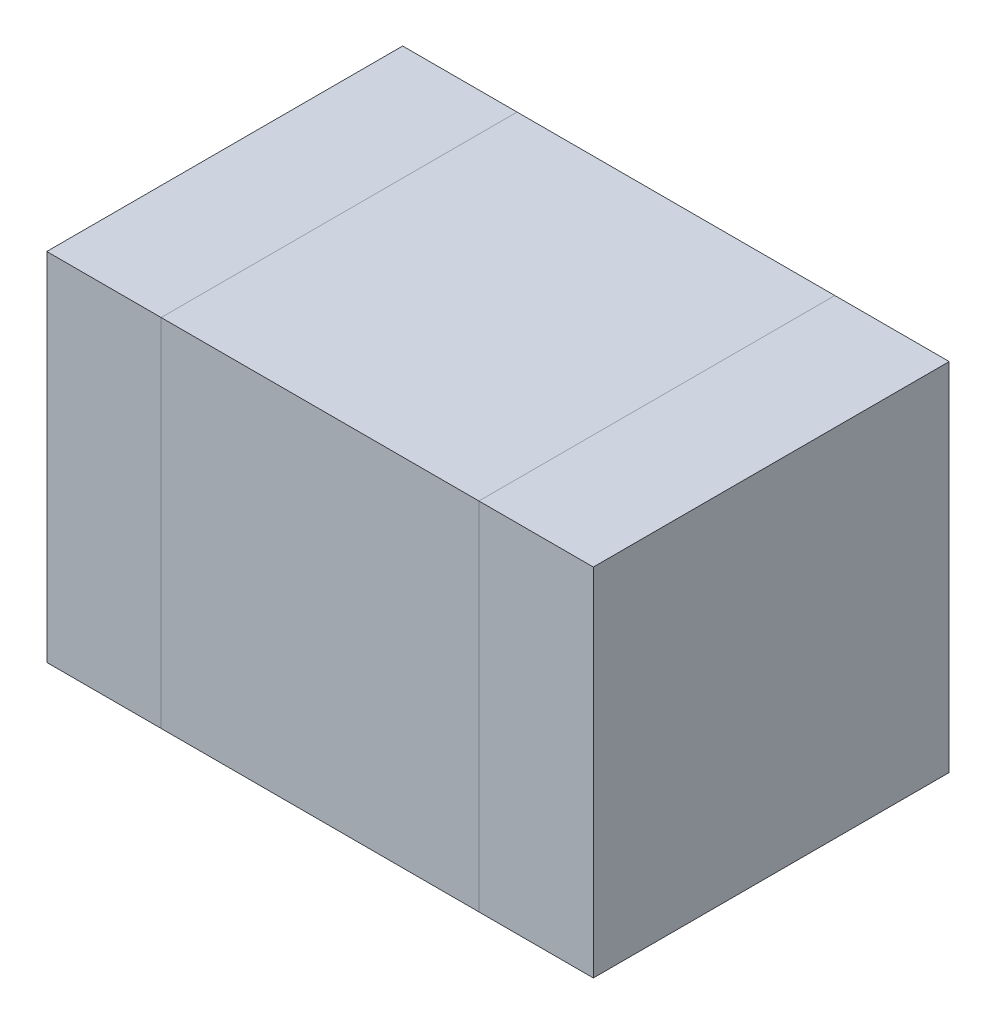
ISO-10303-21;
HEADER;
FILE_DESCRIPTION(('STEP AP214'),'2;1');
FILE_NAME('part.step','',(''),(''),'','','');
FILE_SCHEMA(('AUTOMOTIVE_DESIGN { 1 0 10303 214 1 1 1 1 }'));
ENDSEC;
DATA;
#1=APPLICATION_CONTEXT('core data for automotive mechanical design processes');
#2=APPLICATION_PROTOCOL_DEFINITION('international standard','automotive_design',2000,#1);
#3=PRODUCT_CONTEXT('',#1,'mechanical');
#4=PRODUCT('Part','Part','',(#3));
#5=PRODUCT_RELATED_PRODUCT_CATEGORY('part','',(#4));
#6=PRODUCT_DEFINITION_FORMATION('','',#4);
#7=PRODUCT_DEFINITION_CONTEXT('part definition',#1,'design');
#8=PRODUCT_DEFINITION('design','',#6,#7);
#9=PRODUCT_DEFINITION_SHAPE('','',#8);
#10=(LENGTH_UNIT() NAMED_UNIT(*) SI_UNIT(.MILLI.,.METRE.));
#11=(NAMED_UNIT(*) PLANE_ANGLE_UNIT() SI_UNIT($,.RADIAN.));
#12=(NAMED_UNIT(*) SI_UNIT($,.STERADIAN.) SOLID_ANGLE_UNIT());
#13=UNCERTAINTY_MEASURE_WITH_UNIT(LENGTH_MEASURE(1.E-05),#10,'distance_accuracy_value','');
#14=(GEOMETRIC_REPRESENTATION_CONTEXT(3) GLOBAL_UNCERTAINTY_ASSIGNED_CONTEXT((#13)) GLOBAL_UNIT_ASSIGNED_CONTEXT((#10,
#11,#12)) REPRESENTATION_CONTEXT('',''));
#15=CARTESIAN_POINT('',(0.,0.,0.));
#16=DIRECTION('',(0.,0.,1.));
#17=DIRECTION('',(1.,0.,0.));
#18=AXIS2_PLACEMENT_3D('',#15,#16,#17);
#19=CARTESIAN_POINT('',(1.07499742071203,-0.70000742291051,0.));
#20=DIRECTION('',(0.999999999999987,1.6292067073209E-07,0.));
#21=DIRECTION('',(-1.6292067073209E-07,0.999999999999987,0.));
#22=AXIS2_PLACEMENT_3D('',#19,#20,#21);
#23=PLANE('',#22);
#24=DIRECTION('',(0.,1.,0.));
#25=VECTOR('',#24,1.);
#26=CARTESIAN_POINT('',(1.07499742071203,2.19999766349792,1.39999973773956));
#27=LINE('',#26,#25);
#28=CARTESIAN_POINT('',(1.07499742071203,-0.700007441238961,1.39999973773956));
#29=VERTEX_POINT('',#28);
#30=CARTESIAN_POINT('',(1.07499730666757,0.699992434038342,1.39999973773956));
#31=VERTEX_POINT('',#30);
#32=EDGE_CURVE('P0_E68',#29,#31,#27,.T.);
#33=ORIENTED_EDGE('',*,*,#32,.F.);
#34=DIRECTION('',(0.,0.,1.));
#35=VECTOR('',#34,1.);
#36=CARTESIAN_POINT('',(1.07499742071203,-0.70000742291051,0.));
#37=LINE('',#36,#35);
#38=CARTESIAN_POINT('',(1.07499742071203,-0.700007459567413,0.));
#39=VERTEX_POINT('',#38);
#40=EDGE_CURVE('P0_E55',#39,#29,#37,.T.);
#41=ORIENTED_EDGE('',*,*,#40,.F.);
#42=DIRECTION('',(0.,1.,0.));
#43=VECTOR('',#42,1.);
#44=CARTESIAN_POINT('',(1.07499742071203,2.19999766349792,0.));
#45=LINE('',#44,#43);
#46=CARTESIAN_POINT('',(1.07499730666757,0.699992434038342,0.));
#47=VERTEX_POINT('',#46);
#48=EDGE_CURVE('P0_E20',#39,#47,#45,.T.);
#49=ORIENTED_EDGE('',*,*,#48,.T.);
#50=DIRECTION('',(0.,0.,1.));
#51=VECTOR('',#50,1.);
#52=CARTESIAN_POINT('',(1.07499719262312,0.699992434038342,0.));
#53=LINE('',#52,#51);
#54=EDGE_CURVE('P0_E81',#31,#47,#53,.F.);
#55=ORIENTED_EDGE('',*,*,#54,.F.);
#56=EDGE_LOOP('',(#33,#41,#49,#55));
#57=FACE_BOUND('',#56,.T.);
#58=ADVANCED_FACE('P0_F17',(#57),#23,.T.);
#59=CARTESIAN_POINT('',(36.0999984741211,2.19999766349792,0.));
#60=DIRECTION('',(0.,0.,1.));
#61=DIRECTION('',(1.,0.,0.));
#62=AXIS2_PLACEMENT_3D('',#59,#60,#61);
#63=PLANE('',#62);
#64=ORIENTED_EDGE('',*,*,#48,.F.);
#65=DIRECTION('',(0.999999999999987,1.6292067073209E-07,0.));
#66=VECTOR('',#65,1.);
#67=CARTESIAN_POINT('',(0.625000472469843,-0.700007496224315,0.));
#68=LINE('',#67,#66);
#69=CARTESIAN_POINT('',(0.625000358425385,-0.700007496224315,0.));
#70=VERTEX_POINT('',#69);
#71=EDGE_CURVE('P0_E61',#70,#39,#68,.T.);
#72=ORIENTED_EDGE('',*,*,#71,.F.);
#73=DIRECTION('',(1.6292067073209E-07,-0.999999999999987,0.));
#74=VECTOR('',#73,1.);
#75=CARTESIAN_POINT('',(0.625000244380928,0.699992360724537,0.));
#76=LINE('',#75,#74);
#77=CARTESIAN_POINT('',(0.625000244380927,0.69999239738144,0.));
#78=VERTEX_POINT('',#77);
#79=EDGE_CURVE('P0_E83',#78,#70,#76,.T.);
#80=ORIENTED_EDGE('',*,*,#79,.F.);
#81=DIRECTION('',(-0.999999999999987,-1.6292067073209E-07,0.));
#82=VECTOR('',#81,1.);
#83=CARTESIAN_POINT('',(1.07499719262312,0.699992434038342,0.));
#84=LINE('',#83,#82);
#85=EDGE_CURVE('P0_E64',#47,#78,#84,.T.);
#86=ORIENTED_EDGE('',*,*,#85,.F.);
#87=EDGE_LOOP('',(#64,#72,#80,#86));
#88=FACE_BOUND('',#87,.T.);
#89=ADVANCED_FACE('P0_F60',(#88),#63,.F.);
#90=CARTESIAN_POINT('',(0.625000472469843,-0.700007496224315,0.));
#91=DIRECTION('',(1.6292067073209E-07,-0.999999999999987,0.));
#92=DIRECTION('',(0.999999999999987,1.6292067073209E-07,0.));
#93=AXIS2_PLACEMENT_3D('',#90,#91,#92);
#94=PLANE('',#93);
#95=DIRECTION('',(1.,0.,0.));
#96=VECTOR('',#95,1.);
#97=CARTESIAN_POINT('',(36.0999984741211,-0.700007496224315,1.39999973773956));
#98=LINE('',#97,#96);
#99=CARTESIAN_POINT('',(0.625000415447614,-0.700007496224315,1.39999973773956));
#100=VERTEX_POINT('',#99);
#101=EDGE_CURVE('P0_E70',#100,#29,#98,.T.);
#102=ORIENTED_EDGE('',*,*,#101,.F.);
#103=DIRECTION('',(0.,0.,1.));
#104=VECTOR('',#103,1.);
#105=CARTESIAN_POINT('',(0.625000472469844,-0.700007496224315,0.));
#106=LINE('',#105,#104);
#107=EDGE_CURVE('P0_E74',#70,#100,#106,.T.);
#108=ORIENTED_EDGE('',*,*,#107,.F.);
#109=ORIENTED_EDGE('',*,*,#71,.T.);
#110=ORIENTED_EDGE('',*,*,#40,.T.);
#111=EDGE_LOOP('',(#102,#108,#109,#110));
#112=FACE_BOUND('',#111,.T.);
#113=ADVANCED_FACE('P0_F72',(#112),#94,.T.);
#114=CARTESIAN_POINT('',(36.0999984741211,2.19999766349792,1.39999973773956));
#115=DIRECTION('',(0.,0.,1.));
#116=DIRECTION('',(1.,0.,0.));
#117=AXIS2_PLACEMENT_3D('',#114,#115,#116);
#118=PLANE('',#117);
#119=ORIENTED_EDGE('',*,*,#32,.T.);
#120=DIRECTION('',(-0.999999999999987,-1.6292067073209E-07,0.));
#121=VECTOR('',#120,1.);
#122=CARTESIAN_POINT('',(1.07499719262312,0.699992434038342,1.39999973773956));
#123=LINE('',#122,#121);
#124=CARTESIAN_POINT('',(0.625000244380927,0.69999239738144,1.39999973773956));
#125=VERTEX_POINT('',#124);
#126=EDGE_CURVE('P0_E35',#125,#31,#123,.F.);
#127=ORIENTED_EDGE('',*,*,#126,.F.);
#128=DIRECTION('',(1.6292067073209E-07,-0.999999999999987,0.));
#129=VECTOR('',#128,1.);
#130=CARTESIAN_POINT('',(0.625000244380928,0.699992360724537,1.39999973773956));
#131=LINE('',#130,#129);
#132=EDGE_CURVE('P0_E26',#100,#125,#131,.F.);
#133=ORIENTED_EDGE('',*,*,#132,.F.);
#134=ORIENTED_EDGE('',*,*,#101,.T.);
#135=EDGE_LOOP('',(#119,#127,#133,#134));
#136=FACE_BOUND('',#135,.T.);
#137=ADVANCED_FACE('P0_F89',(#136),#118,.T.);
#138=CARTESIAN_POINT('',(1.07499719262312,0.699992434038342,0.));
#139=DIRECTION('',(-1.6292067073209E-07,0.999999999999987,0.));
#140=DIRECTION('',(-0.999999999999987,-1.6292067073209E-07,0.));
#141=AXIS2_PLACEMENT_3D('',#138,#139,#140);
#142=PLANE('',#141);
#143=ORIENTED_EDGE('',*,*,#126,.T.);
#144=ORIENTED_EDGE('',*,*,#54,.T.);
#145=ORIENTED_EDGE('',*,*,#85,.T.);
#146=DIRECTION('',(0.,0.,1.));
#147=VECTOR('',#146,1.);
#148=CARTESIAN_POINT('',(0.625000244380928,0.699992360724537,0.));
#149=LINE('',#148,#147);
#150=EDGE_CURVE('P0_E11',#125,#78,#149,.F.);
#151=ORIENTED_EDGE('',*,*,#150,.F.);
#152=EDGE_LOOP('',(#143,#144,#145,#151));
#153=FACE_BOUND('',#152,.T.);
#154=ADVANCED_FACE('P0_F91',(#153),#142,.T.);
#155=CARTESIAN_POINT('',(0.625000244380928,0.699992360724537,0.));
#156=DIRECTION('',(-0.999999999999987,-1.6292067073209E-07,0.));
#157=DIRECTION('',(1.6292067073209E-07,-0.999999999999987,0.));
#158=AXIS2_PLACEMENT_3D('',#155,#156,#157);
#159=PLANE('',#158);
#160=ORIENTED_EDGE('',*,*,#132,.T.);
#161=ORIENTED_EDGE('',*,*,#150,.T.);
#162=ORIENTED_EDGE('',*,*,#79,.T.);
#163=ORIENTED_EDGE('',*,*,#107,.T.);
#164=EDGE_LOOP('',(#160,#161,#162,#163));
#165=FACE_BOUND('',#164,.T.);
#166=ADVANCED_FACE('P0_F88',(#165),#159,.T.);
#167=CLOSED_SHELL('',(#58,#89,#113,#137,#154,#166));
#168=MANIFOLD_SOLID_BREP('P0_B1',#167);
#169=CARTESIAN_POINT('',(0.625000472469843,-0.700007496224315,0.));
#170=DIRECTION('',(0.999999999999987,1.6292067073209E-07,0.));
#171=DIRECTION('',(-1.6292067073209E-07,0.999999999999987,0.));
#172=AXIS2_PLACEMENT_3D('',#169,#170,#171);
#173=PLANE('',#172);
#174=DIRECTION('',(0.,1.,0.));
#175=VECTOR('',#174,1.);
#176=CARTESIAN_POINT('',(0.625000472469842,2.19999766349792,1.39999973773956));
#177=LINE('',#176,#175);
#178=CARTESIAN_POINT('',(0.625000472469843,-0.700007547137025,1.39999973773956));
#179=VERTEX_POINT('',#178);
#180=CARTESIAN_POINT('',(0.625000358425385,0.699992360724537,1.39999973773956));
#181=VERTEX_POINT('',#180);
#182=EDGE_CURVE('P1_E68',#179,#181,#177,.T.);
#183=ORIENTED_EDGE('',*,*,#182,.F.);
#184=DIRECTION('',(0.,0.,1.));
#185=VECTOR('',#184,1.);
#186=CARTESIAN_POINT('',(0.625000472469843,-0.700007496224316,0.));
#187=LINE('',#186,#185);
#188=CARTESIAN_POINT('',(0.625000472469842,-0.700007598049735,0.));
#189=VERTEX_POINT('',#188);
#190=EDGE_CURVE('P1_E55',#189,#179,#187,.T.);
#191=ORIENTED_EDGE('',*,*,#190,.F.);
#192=DIRECTION('',(0.,1.,0.));
#193=VECTOR('',#192,1.);
#194=CARTESIAN_POINT('',(0.625000472469842,2.19999766349792,0.));
#195=LINE('',#194,#193);
#196=CARTESIAN_POINT('',(0.625000358425385,0.699992360724537,0.));
#197=VERTEX_POINT('',#196);
#198=EDGE_CURVE('P1_E20',#189,#197,#195,.T.);
#199=ORIENTED_EDGE('',*,*,#198,.T.);
#200=DIRECTION('',(0.,0.,1.));
#201=VECTOR('',#200,1.);
#202=CARTESIAN_POINT('',(0.625000244380928,0.699992360724537,0.));
#203=LINE('',#202,#201);
#204=EDGE_CURVE('P1_E81',#181,#197,#203,.F.);
#205=ORIENTED_EDGE('',*,*,#204,.F.);
#206=EDGE_LOOP('',(#183,#191,#199,#205));
#207=FACE_BOUND('',#206,.T.);
#208=ADVANCED_FACE('P1_F17',(#207),#173,.T.);
#209=CARTESIAN_POINT('',(36.0999984741211,2.19999766349792,0.));
#210=DIRECTION('',(0.,0.,1.));
#211=DIRECTION('',(1.,0.,0.));
#212=AXIS2_PLACEMENT_3D('',#209,#210,#211);
#213=PLANE('',#212);
#214=ORIENTED_EDGE('',*,*,#198,.F.);
#215=DIRECTION('',(0.999999999999987,1.6292067073209E-07,0.));
#216=VECTOR('',#215,1.);
#217=CARTESIAN_POINT('',(-0.624999527530157,-0.700007699875154,0.));
#218=LINE('',#217,#216);
#219=CARTESIAN_POINT('',(-0.624999641574616,-0.700007699875154,0.));
#220=VERTEX_POINT('',#219);
#221=EDGE_CURVE('P1_E61',#220,#189,#218,.T.);
#222=ORIENTED_EDGE('',*,*,#221,.F.);
#223=DIRECTION('',(1.6292067073209E-07,-0.999999999999987,0.));
#224=VECTOR('',#223,1.);
#225=CARTESIAN_POINT('',(-0.624999755619072,0.699992157073699,0.));
#226=LINE('',#225,#224);
#227=CARTESIAN_POINT('',(-0.624999755619074,0.699992258899118,0.));
#228=VERTEX_POINT('',#227);
#229=EDGE_CURVE('P1_E83',#228,#220,#226,.T.);
#230=ORIENTED_EDGE('',*,*,#229,.F.);
#231=DIRECTION('',(-0.999999999999987,-1.6292067073209E-07,0.));
#232=VECTOR('',#231,1.);
#233=CARTESIAN_POINT('',(0.625000244380928,0.699992360724537,0.));
#234=LINE('',#233,#232);
#235=EDGE_CURVE('P1_E64',#197,#228,#234,.T.);
#236=ORIENTED_EDGE('',*,*,#235,.F.);
#237=EDGE_LOOP('',(#214,#222,#230,#236));
#238=FACE_BOUND('',#237,.T.);
#239=ADVANCED_FACE('P1_F60',(#238),#213,.F.);
#240=CARTESIAN_POINT('',(-0.624999527530157,-0.700007699875154,0.));
#241=DIRECTION('',(1.6292067073209E-07,-0.999999999999987,0.));
#242=DIRECTION('',(0.999999999999987,1.6292067073209E-07,0.));
#243=AXIS2_PLACEMENT_3D('',#240,#241,#242);
#244=PLANE('',#243);
#245=DIRECTION('',(1.,0.,0.));
#246=VECTOR('',#245,1.);
#247=CARTESIAN_POINT('',(36.0999984741211,-0.700007699875154,1.39999973773956));
#248=LINE('',#247,#246);
#249=CARTESIAN_POINT('',(-0.624999584552386,-0.700007699875154,1.39999973773956));
#250=VERTEX_POINT('',#249);
#251=EDGE_CURVE('P1_E70',#250,#179,#248,.T.);
#252=ORIENTED_EDGE('',*,*,#251,.F.);
#253=DIRECTION('',(0.,0.,1.));
#254=VECTOR('',#253,1.);
#255=CARTESIAN_POINT('',(-0.624999527530156,-0.700007699875154,0.));
#256=LINE('',#255,#254);
#257=EDGE_CURVE('P1_E74',#220,#250,#256,.T.);
#258=ORIENTED_EDGE('',*,*,#257,.F.);
#259=ORIENTED_EDGE('',*,*,#221,.T.);
#260=ORIENTED_EDGE('',*,*,#190,.T.);
#261=EDGE_LOOP('',(#252,#258,#259,#260));
#262=FACE_BOUND('',#261,.T.);
#263=ADVANCED_FACE('P1_F72',(#262),#244,.T.);
#264=CARTESIAN_POINT('',(36.0999984741211,2.19999766349792,1.39999973773956));
#265=DIRECTION('',(0.,0.,1.));
#266=DIRECTION('',(1.,0.,0.));
#267=AXIS2_PLACEMENT_3D('',#264,#265,#266);
#268=PLANE('',#267);
#269=ORIENTED_EDGE('',*,*,#182,.T.);
#270=DIRECTION('',(-0.999999999999987,-1.6292067073209E-07,0.));
#271=VECTOR('',#270,1.);
#272=CARTESIAN_POINT('',(0.625000244380928,0.699992360724537,1.39999973773956));
#273=LINE('',#272,#271);
#274=CARTESIAN_POINT('',(-0.624999755619074,0.699992258899118,1.39999973773956));
#275=VERTEX_POINT('',#274);
#276=EDGE_CURVE('P1_E35',#275,#181,#273,.F.);
#277=ORIENTED_EDGE('',*,*,#276,.F.);
#278=DIRECTION('',(1.6292067073209E-07,-0.999999999999987,0.));
#279=VECTOR('',#278,1.);
#280=CARTESIAN_POINT('',(-0.624999755619072,0.699992157073699,1.39999973773956));
#281=LINE('',#280,#279);
#282=EDGE_CURVE('P1_E26',#250,#275,#281,.F.);
#283=ORIENTED_EDGE('',*,*,#282,.F.);
#284=ORIENTED_EDGE('',*,*,#251,.T.);
#285=EDGE_LOOP('',(#269,#277,#283,#284));
#286=FACE_BOUND('',#285,.T.);
#287=ADVANCED_FACE('P1_F89',(#286),#268,.T.);
#288=CARTESIAN_POINT('',(0.625000244380928,0.699992360724537,0.));
#289=DIRECTION('',(-1.6292067073209E-07,0.999999999999987,0.));
#290=DIRECTION('',(-0.999999999999987,-1.6292067073209E-07,0.));
#291=AXIS2_PLACEMENT_3D('',#288,#289,#290);
#292=PLANE('',#291);
#293=ORIENTED_EDGE('',*,*,#276,.T.);
#294=ORIENTED_EDGE('',*,*,#204,.T.);
#295=ORIENTED_EDGE('',*,*,#235,.T.);
#296=DIRECTION('',(0.,0.,1.));
#297=VECTOR('',#296,1.);
#298=CARTESIAN_POINT('',(-0.624999755619072,0.699992157073699,0.));
#299=LINE('',#298,#297);
#300=EDGE_CURVE('P1_E11',#275,#228,#299,.F.);
#301=ORIENTED_EDGE('',*,*,#300,.F.);
#302=EDGE_LOOP('',(#293,#294,#295,#301));
#303=FACE_BOUND('',#302,.T.);
#304=ADVANCED_FACE('P1_F91',(#303),#292,.T.);
#305=CARTESIAN_POINT('',(-0.624999755619072,0.699992157073699,0.));
#306=DIRECTION('',(-0.999999999999987,-1.6292067073209E-07,0.));
#307=DIRECTION('',(1.6292067073209E-07,-0.999999999999987,0.));
#308=AXIS2_PLACEMENT_3D('',#305,#306,#307);
#309=PLANE('',#308);
#310=ORIENTED_EDGE('',*,*,#282,.T.);
#311=ORIENTED_EDGE('',*,*,#300,.T.);
#312=ORIENTED_EDGE('',*,*,#229,.T.);
#313=ORIENTED_EDGE('',*,*,#257,.T.);
#314=EDGE_LOOP('',(#310,#311,#312,#313));
#315=FACE_BOUND('',#314,.T.);
#316=ADVANCED_FACE('P1_F88',(#315),#309,.T.);
#317=CLOSED_SHELL('',(#208,#239,#263,#287,#304,#316));
#318=MANIFOLD_SOLID_BREP('P1_B1',#317);
#319=CARTESIAN_POINT('',(-0.624999527530157,-0.700007699875154,0.));
#320=DIRECTION('',(0.999999999999987,1.6292067073209E-07,0.));
#321=DIRECTION('',(-1.6292067073209E-07,0.999999999999987,0.));
#322=AXIS2_PLACEMENT_3D('',#319,#320,#321);
#323=PLANE('',#322);
#324=DIRECTION('',(0.,1.,0.));
#325=VECTOR('',#324,1.);
#326=CARTESIAN_POINT('',(-0.62499952753016,2.19999766349792,1.39999973773956));
#327=LINE('',#326,#325);
#328=CARTESIAN_POINT('',(-0.624999527530158,-0.700007718203761,1.39999973773956));
#329=VERTEX_POINT('',#328);
#330=CARTESIAN_POINT('',(-0.624999641574616,0.699992157073699,1.39999973773956));
#331=VERTEX_POINT('',#330);
#332=EDGE_CURVE('P2_E68',#329,#331,#327,.T.);
#333=ORIENTED_EDGE('',*,*,#332,.F.);
#334=DIRECTION('',(0.,0.,1.));
#335=VECTOR('',#334,1.);
#336=CARTESIAN_POINT('',(-0.624999527530157,-0.700007699875154,0.));
#337=LINE('',#336,#335);
#338=CARTESIAN_POINT('',(-0.624999527530158,-0.700007736532367,0.));
#339=VERTEX_POINT('',#338);
#340=EDGE_CURVE('P2_E55',#339,#329,#337,.T.);
#341=ORIENTED_EDGE('',*,*,#340,.F.);
#342=DIRECTION('',(0.,1.,0.));
#343=VECTOR('',#342,1.);
#344=CARTESIAN_POINT('',(-0.62499952753016,2.19999766349792,0.));
#345=LINE('',#344,#343);
#346=CARTESIAN_POINT('',(-0.624999641574616,0.699992157073699,0.));
#347=VERTEX_POINT('',#346);
#348=EDGE_CURVE('P2_E20',#339,#347,#345,.T.);
#349=ORIENTED_EDGE('',*,*,#348,.T.);
#350=DIRECTION('',(0.,0.,1.));
#351=VECTOR('',#350,1.);
#352=CARTESIAN_POINT('',(-0.624999755619072,0.699992157073699,0.));
#353=LINE('',#352,#351);
#354=EDGE_CURVE('P2_E81',#331,#347,#353,.F.);
#355=ORIENTED_EDGE('',*,*,#354,.F.);
#356=EDGE_LOOP('',(#333,#341,#349,#355));
#357=FACE_BOUND('',#356,.T.);
#358=ADVANCED_FACE('P2_F17',(#357),#323,.T.);
#359=CARTESIAN_POINT('',(36.0999984741211,2.19999766349792,0.));
#360=DIRECTION('',(0.,0.,1.));
#361=DIRECTION('',(1.,0.,0.));
#362=AXIS2_PLACEMENT_3D('',#359,#360,#361);
#363=PLANE('',#362);
#364=ORIENTED_EDGE('',*,*,#348,.F.);
#365=DIRECTION('',(0.999999999999987,1.6292067073209E-07,0.));
#366=VECTOR('',#365,1.);
#367=CARTESIAN_POINT('',(-1.07500029046961,-0.70000777318958,0.));
#368=LINE('',#367,#366);
#369=CARTESIAN_POINT('',(-1.07500040451407,-0.70000777318958,0.));
#370=VERTEX_POINT('',#369);
#371=EDGE_CURVE('P2_E61',#370,#339,#368,.T.);
#372=ORIENTED_EDGE('',*,*,#371,.F.);
#373=DIRECTION('',(1.6292067073209E-07,-0.999999999999987,0.));
#374=VECTOR('',#373,1.);
#375=CARTESIAN_POINT('',(-1.07500051855853,0.699992083759273,0.));
#376=LINE('',#375,#374);
#377=CARTESIAN_POINT('',(-1.07500051855853,0.699992120416486,0.));
#378=VERTEX_POINT('',#377);
#379=EDGE_CURVE('P2_E83',#378,#370,#376,.T.);
#380=ORIENTED_EDGE('',*,*,#379,.F.);
#381=DIRECTION('',(-0.999999999999987,-1.6292067073209E-07,0.));
#382=VECTOR('',#381,1.);
#383=CARTESIAN_POINT('',(-0.624999755619072,0.699992157073699,0.));
#384=LINE('',#383,#382);
#385=EDGE_CURVE('P2_E64',#347,#378,#384,.T.);
#386=ORIENTED_EDGE('',*,*,#385,.F.);
#387=EDGE_LOOP('',(#364,#372,#380,#386));
#388=FACE_BOUND('',#387,.T.);
#389=ADVANCED_FACE('P2_F60',(#388),#363,.F.);
#390=CARTESIAN_POINT('',(-1.07500029046961,-0.70000777318958,0.));
#391=DIRECTION('',(1.6292067073209E-07,-0.999999999999987,0.));
#392=DIRECTION('',(0.999999999999987,1.6292067073209E-07,0.));
#393=AXIS2_PLACEMENT_3D('',#390,#391,#392);
#394=PLANE('',#393);
#395=DIRECTION('',(1.,0.,0.));
#396=VECTOR('',#395,1.);
#397=CARTESIAN_POINT('',(36.0999984741211,-0.70000777318958,1.39999973773956));
#398=LINE('',#397,#396);
#399=CARTESIAN_POINT('',(-1.07500034749184,-0.70000777318958,1.39999973773956));
#400=VERTEX_POINT('',#399);
#401=EDGE_CURVE('P2_E70',#400,#329,#398,.T.);
#402=ORIENTED_EDGE('',*,*,#401,.F.);
#403=DIRECTION('',(0.,0.,1.));
#404=VECTOR('',#403,1.);
#405=CARTESIAN_POINT('',(-1.07500029046961,-0.70000777318958,0.));
#406=LINE('',#405,#404);
#407=EDGE_CURVE('P2_E74',#370,#400,#406,.T.);
#408=ORIENTED_EDGE('',*,*,#407,.F.);
#409=ORIENTED_EDGE('',*,*,#371,.T.);
#410=ORIENTED_EDGE('',*,*,#340,.T.);
#411=EDGE_LOOP('',(#402,#408,#409,#410));
#412=FACE_BOUND('',#411,.T.);
#413=ADVANCED_FACE('P2_F72',(#412),#394,.T.);
#414=CARTESIAN_POINT('',(36.0999984741211,2.19999766349792,1.39999973773956));
#415=DIRECTION('',(0.,0.,1.));
#416=DIRECTION('',(1.,0.,0.));
#417=AXIS2_PLACEMENT_3D('',#414,#415,#416);
#418=PLANE('',#417);
#419=ORIENTED_EDGE('',*,*,#332,.T.);
#420=DIRECTION('',(-0.999999999999987,-1.6292067073209E-07,0.));
#421=VECTOR('',#420,1.);
#422=CARTESIAN_POINT('',(-0.624999755619072,0.699992157073699,1.39999973773956));
#423=LINE('',#422,#421);
#424=CARTESIAN_POINT('',(-1.07500051855853,0.699992120416486,1.39999973773956));
#425=VERTEX_POINT('',#424);
#426=EDGE_CURVE('P2_E35',#425,#331,#423,.F.);
#427=ORIENTED_EDGE('',*,*,#426,.F.);
#428=DIRECTION('',(1.6292067073209E-07,-0.999999999999987,0.));
#429=VECTOR('',#428,1.);
#430=CARTESIAN_POINT('',(-1.07500051855853,0.699992083759273,1.39999973773956));
#431=LINE('',#430,#429);
#432=EDGE_CURVE('P2_E26',#400,#425,#431,.F.);
#433=ORIENTED_EDGE('',*,*,#432,.F.);
#434=ORIENTED_EDGE('',*,*,#401,.T.);
#435=EDGE_LOOP('',(#419,#427,#433,#434));
#436=FACE_BOUND('',#435,.T.);
#437=ADVANCED_FACE('P2_F89',(#436),#418,.T.);
#438=CARTESIAN_POINT('',(-0.624999755619072,0.699992157073699,0.));
#439=DIRECTION('',(-1.6292067073209E-07,0.999999999999987,0.));
#440=DIRECTION('',(-0.999999999999987,-1.6292067073209E-07,0.));
#441=AXIS2_PLACEMENT_3D('',#438,#439,#440);
#442=PLANE('',#441);
#443=ORIENTED_EDGE('',*,*,#426,.T.);
#444=ORIENTED_EDGE('',*,*,#354,.T.);
#445=ORIENTED_EDGE('',*,*,#385,.T.);
#446=DIRECTION('',(0.,0.,1.));
#447=VECTOR('',#446,1.);
#448=CARTESIAN_POINT('',(-1.07500051855853,0.699992083759273,0.));
#449=LINE('',#448,#447);
#450=EDGE_CURVE('P2_E11',#425,#378,#449,.F.);
#451=ORIENTED_EDGE('',*,*,#450,.F.);
#452=EDGE_LOOP('',(#443,#444,#445,#451));
#453=FACE_BOUND('',#452,.T.);
#454=ADVANCED_FACE('P2_F91',(#453),#442,.T.);
#455=CARTESIAN_POINT('',(-1.07500051855853,0.699992083759273,0.));
#456=DIRECTION('',(-0.999999999999987,-1.6292067073209E-07,0.));
#457=DIRECTION('',(1.6292067073209E-07,-0.999999999999987,0.));
#458=AXIS2_PLACEMENT_3D('',#455,#456,#457);
#459=PLANE('',#458);
#460=ORIENTED_EDGE('',*,*,#432,.T.);
#461=ORIENTED_EDGE('',*,*,#450,.T.);
#462=ORIENTED_EDGE('',*,*,#379,.T.);
#463=ORIENTED_EDGE('',*,*,#407,.T.);
#464=EDGE_LOOP('',(#460,#461,#462,#463));
#465=FACE_BOUND('',#464,.T.);
#466=ADVANCED_FACE('P2_F88',(#465),#459,.T.);
#467=CLOSED_SHELL('',(#358,#389,#413,#437,#454,#466));
#468=MANIFOLD_SOLID_BREP('P2_B1',#467);
#469=ADVANCED_BREP_SHAPE_REPRESENTATION('',(#18,#168,#318,#468),#14);
#470=SHAPE_DEFINITION_REPRESENTATION(#9,#469);
ENDSEC;
END-ISO-10303-21;
